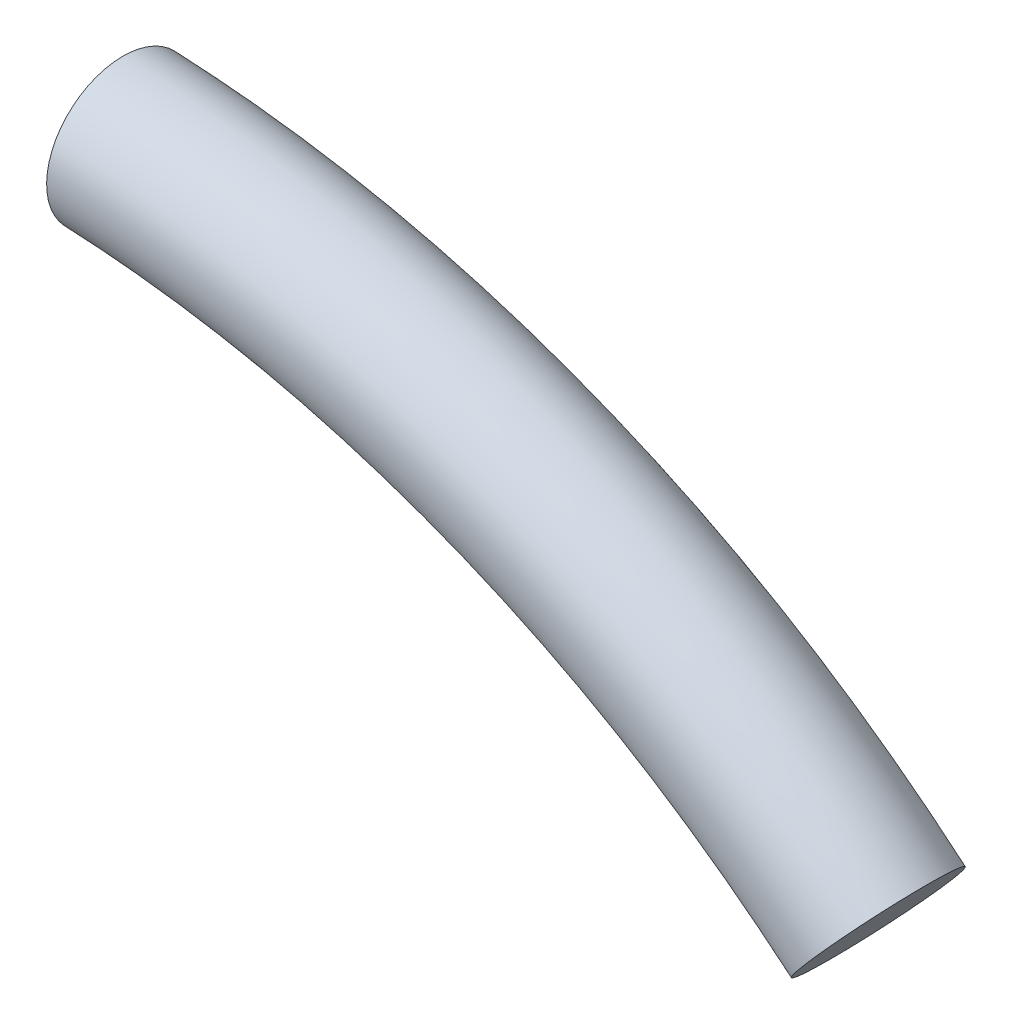
ISO-10303-21;
HEADER;
FILE_DESCRIPTION(('STEP AP214'),'2;1');
FILE_NAME('part.step','',(''),(''),'','','');
FILE_SCHEMA(('AUTOMOTIVE_DESIGN { 1 0 10303 214 1 1 1 1 }'));
ENDSEC;
DATA;
#1=APPLICATION_CONTEXT('core data for automotive mechanical design processes');
#2=APPLICATION_PROTOCOL_DEFINITION('international standard','automotive_design',2000,#1);
#3=PRODUCT_CONTEXT('',#1,'mechanical');
#4=PRODUCT('Part','Part','',(#3));
#5=PRODUCT_RELATED_PRODUCT_CATEGORY('part','',(#4));
#6=PRODUCT_DEFINITION_FORMATION('','',#4);
#7=PRODUCT_DEFINITION_CONTEXT('part definition',#1,'design');
#8=PRODUCT_DEFINITION('design','',#6,#7);
#9=PRODUCT_DEFINITION_SHAPE('','',#8);
#10=(LENGTH_UNIT() NAMED_UNIT(*) SI_UNIT(.MILLI.,.METRE.));
#11=(NAMED_UNIT(*) PLANE_ANGLE_UNIT() SI_UNIT($,.RADIAN.));
#12=(NAMED_UNIT(*) SI_UNIT($,.STERADIAN.) SOLID_ANGLE_UNIT());
#13=UNCERTAINTY_MEASURE_WITH_UNIT(LENGTH_MEASURE(1.E-05),#10,'distance_accuracy_value','');
#14=(GEOMETRIC_REPRESENTATION_CONTEXT(3) GLOBAL_UNCERTAINTY_ASSIGNED_CONTEXT((#13)) GLOBAL_UNIT_ASSIGNED_CONTEXT((#10,
#11,#12)) REPRESENTATION_CONTEXT('',''));
#15=CARTESIAN_POINT('',(0.,0.,0.));
#16=DIRECTION('',(0.,0.,1.));
#17=DIRECTION('',(1.,0.,0.));
#18=AXIS2_PLACEMENT_3D('',#15,#16,#17);
#19=CARTESIAN_POINT('',(0.,0.,-107.5));
#20=DIRECTION('',(0.759975633659856,-0.649951564536389,0.));
#21=DIRECTION('',(0.649951564536389,0.759975633659856,0.));
#22=AXIS2_PLACEMENT_3D('',#19,#20,#21);
#23=PLANE('',#22);
#24=CARTESIAN_POINT('',(4.72006253645162,5.51907667090961,-102.2302));
#25=CARTESIAN_POINT('',(4.72006133685012,5.51907526823907,-102.25265524156));
#26=CARTESIAN_POINT('',(4.71882902740505,5.51763435294248,-102.275130857259));
#27=CARTESIAN_POINT('',(4.71392650044844,5.51190192419906,-102.319482451298));
#28=CARTESIAN_POINT('',(4.71025106526411,5.50760430982962,-102.341357041711));
#29=CARTESIAN_POINT('',(4.7005717856094,5.49628651771968,-102.383809618347));
#30=CARTESIAN_POINT('',(4.69457209694046,5.48927119927638,-102.404389843003));
#31=CARTESIAN_POINT('',(4.68040349251983,5.47270412765109,-102.443737337222));
#32=CARTESIAN_POINT('',(4.67223149947683,5.46314877625264,-102.46250198299));
#33=CARTESIAN_POINT('',(4.65396766069821,5.44179322730686,-102.497627484938));
#34=CARTESIAN_POINT('',(4.64387853832205,5.42999621413041,-102.513991693303));
#35=CARTESIAN_POINT('',(4.62204353491342,5.40446497233199,-102.543904884907));
#36=CARTESIAN_POINT('',(4.6102953543539,5.39072805491809,-102.557449895039));
#37=CARTESIAN_POINT('',(4.58549604826536,5.36173071205854,-102.581301941874));
#38=CARTESIAN_POINT('',(4.57244587798105,5.34647140356182,-102.5916113298));
#39=CARTESIAN_POINT('',(4.54540503770203,5.31485307867878,-102.608713483024));
#40=CARTESIAN_POINT('',(4.5314143124317,5.29849399765978,-102.615506041437));
#41=CARTESIAN_POINT('',(4.50289066796777,5.26514185888737,-102.625380612929));
#42=CARTESIAN_POINT('',(4.48835776473142,5.24814881979246,-102.628462735124));
#43=CARTESIAN_POINT('',(4.45916191772213,5.21401068775035,-102.630829316177));
#44=CARTESIAN_POINT('',(4.4444989739492,5.19686559480315,-102.630113775036));
#45=CARTESIAN_POINT('',(4.41545885049525,5.16290954726411,-102.624905254934));
#46=CARTESIAN_POINT('',(4.40108167923109,5.14609860251392,-102.620412164882));
#47=CARTESIAN_POINT('',(4.37302254405149,5.11328960534923,-102.607776350926));
#48=CARTESIAN_POINT('',(4.35934053929569,5.09729150518088,-102.599633841699));
#49=CARTESIAN_POINT('',(4.33304954581745,5.06654996147459,-102.579923114515));
#50=CARTESIAN_POINT('',(4.32044134647498,5.05180744094317,-102.568352403919));
#51=CARTESIAN_POINT('',(4.29668430006736,5.02402879191353,-102.542134850302));
#52=CARTESIAN_POINT('',(4.28553343754824,5.01099030678446,-102.527492330157));
#53=CARTESIAN_POINT('',(4.26497181172359,4.98694800045305,-102.495513974748));
#54=CARTESIAN_POINT('',(4.25556352776416,4.97594707830155,-102.478174365578));
#55=CARTESIAN_POINT('',(4.23878612476033,4.95632958959205,-102.441335318358));
#56=CARTESIAN_POINT('',(4.23141412465217,4.94770965426266,-102.421838987082));
#57=CARTESIAN_POINT('',(4.21888913251816,4.9330644262903,-102.381186262625));
#58=CARTESIAN_POINT('',(4.21374012041394,4.92704378729174,-102.36002697154));
#59=CARTESIAN_POINT('',(4.20583574404259,4.91780135482558,-102.316713490036));
#60=CARTESIAN_POINT('',(4.20307528577545,4.91457360504355,-102.294561523395));
#61=CARTESIAN_POINT('',(4.20058098439812,4.9116570672995,-102.258269762147));
#62=CARTESIAN_POINT('',(4.20010053483989,4.91109528704173,-102.244238862857));
#63=CARTESIAN_POINT('',(4.20010248442401,4.91109756665226,-102.20774475844));
#64=CARTESIAN_POINT('',(4.20133479386908,4.91253848194885,-102.185269142741));
#65=CARTESIAN_POINT('',(4.20623732082569,4.91827091069228,-102.140917548703));
#66=CARTESIAN_POINT('',(4.20991275601002,4.92256852506171,-102.119042958289));
#67=CARTESIAN_POINT('',(4.21959203566473,4.93388631717166,-102.076590381653));
#68=CARTESIAN_POINT('',(4.22559172433367,4.94090163561496,-102.056010156997));
#69=CARTESIAN_POINT('',(4.2397603287543,4.95746870724024,-102.016662662778));
#70=CARTESIAN_POINT('',(4.2479323217973,4.96702405863869,-101.99789801701));
#71=CARTESIAN_POINT('',(4.26619616057591,4.98837960758447,-101.962772515062));
#72=CARTESIAN_POINT('',(4.27628528295207,5.00017662076093,-101.946408306697));
#73=CARTESIAN_POINT('',(4.2981202863607,5.02570786255934,-101.916495115093));
#74=CARTESIAN_POINT('',(4.30986846692022,5.03944477997324,-101.902950104961));
#75=CARTESIAN_POINT('',(4.33466777300876,5.06844212283279,-101.879098058126));
#76=CARTESIAN_POINT('',(4.34771794329307,5.08370143132952,-101.8687886702));
#77=CARTESIAN_POINT('',(4.3747587835721,5.11531975621255,-101.851686516976));
#78=CARTESIAN_POINT('',(4.38874950884242,5.13167883723155,-101.844893958563));
#79=CARTESIAN_POINT('',(4.41727315330635,5.16503097600396,-101.835019387071));
#80=CARTESIAN_POINT('',(4.43180605654271,5.18202401509887,-101.831937264876));
#81=CARTESIAN_POINT('',(4.461001903552,5.21616214714098,-101.829570683823));
#82=CARTESIAN_POINT('',(4.47566484732493,5.23330724008818,-101.830286224964));
#83=CARTESIAN_POINT('',(4.50470497077887,5.26726328762722,-101.835494745066));
#84=CARTESIAN_POINT('',(4.51908214204304,5.28407423237741,-101.839987835118));
#85=CARTESIAN_POINT('',(4.54714127722264,5.3168832295421,-101.852623649074));
#86=CARTESIAN_POINT('',(4.56082328197844,5.33288132971045,-101.860766158301));
#87=CARTESIAN_POINT('',(4.58711427545667,5.36362287341674,-101.880476885485));
#88=CARTESIAN_POINT('',(4.59972247479914,5.37836539394816,-101.892047596081));
#89=CARTESIAN_POINT('',(4.62347952120677,5.40614404297781,-101.918265149698));
#90=CARTESIAN_POINT('',(4.63463038372589,5.41918252810687,-101.932907669844));
#91=CARTESIAN_POINT('',(4.65519200955053,5.44322483443828,-101.964886025252));
#92=CARTESIAN_POINT('',(4.66460029350996,5.45422575658979,-101.982225634422));
#93=CARTESIAN_POINT('',(4.6813776965138,5.47384324529928,-102.019064681642));
#94=CARTESIAN_POINT('',(4.68874969662196,5.48246318062867,-102.038561012918));
#95=CARTESIAN_POINT('',(4.70127468875597,5.49710840860103,-102.079213737375));
#96=CARTESIAN_POINT('',(4.70642370086018,5.50312904759959,-102.10037302846));
#97=CARTESIAN_POINT('',(4.71432807723154,5.51237148006575,-102.143686509964));
#98=CARTESIAN_POINT('',(4.71708853549867,5.51559922984778,-102.165838476605));
#99=CARTESIAN_POINT('',(4.71958283687601,5.51851576759183,-102.202130237853));
#100=CARTESIAN_POINT('',(4.72006328643424,5.5190775478496,-102.216161137143));
#101=CARTESIAN_POINT('',(4.72006253645162,5.51907667090961,-102.2302));
#102=B_SPLINE_CURVE_WITH_KNOTS('',3,(#24,#25,#26,#27,#28,#29,#30,#31,#32,#33,#34,#35,#36,#37,
#38,#39,#40,#41,#42,#43,#44,#45,#46,#47,#48,#49,#50,#51,#52,#53,#54,#55,#56,#57,#58,#59,#60,#61,
#62,#63,#64,#65,#66,#67,#68,#69,#70,#71,#72,#73,#74,#75,#76,#77,#78,#79,#80,#81,#82,#83,#84,#85,
#86,#87,#88,#89,#90,#91,#92,#93,#94,#95,#96,#97,#98,#99,#100,#101),.UNSPECIFIED.,.T.,.F.,(4,2,2,
2,2,2,2,2,2,2,2,2,2,2,2,2,2,2,2,2,2,2,2,2,2,2,2,2,2,2,2,2,2,2,2,2,2,2,4),(0.,0.0673217190940812,
0.134787678055446,0.202133559490879,0.269575356418609,0.336922056232667,0.404363034793443,
0.471754892083641,0.53915071340354,0.606544552708794,0.673938392014052,0.741334213333949,
0.808726070624146,0.876167049184931,0.943513748998995,1.01095554592845,1.07830142736559,
1.1457673863287,1.21308910542448,1.25517818200736,1.32249990110144,1.3899658600628,
1.45731174149823,1.52475353842596,1.59210023824002,1.6595412168008,1.726933074091,
1.79432889541089,1.86172273471615,1.92911657402141,1.99651239534131,2.0639042526315,
2.13134523119229,2.19869193100635,2.2661337279358,2.33347960937294,2.40094556833606,
2.46826728743184,2.51035636401471),.UNSPECIFIED.);
#103=CARTESIAN_POINT('',(4.72006253645162,5.51907667090961,-102.2302));
#104=VERTEX_POINT('',#103);
#105=EDGE_CURVE('E18',#104,#104,#102,.T.);
#106=ORIENTED_EDGE('',*,*,#105,.F.);
#107=EDGE_LOOP('',(#106));
#108=FACE_BOUND('',#107,.T.);
#109=ADVANCED_FACE('F14',(#108),#23,.T.);
#110=CARTESIAN_POINT('',(0.,0.,-107.5));
#111=DIRECTION('',(0.999019110915743,-0.0442811023476075,0.));
#112=DIRECTION('',(0.0442811023476075,0.999019110915743,0.));
#113=AXIS2_PLACEMENT_3D('',#110,#111,#112);
#114=PLANE('',#113);
#115=CARTESIAN_POINT('',(0.286152268894358,6.45583714274535,-102.2302));
#116=CARTESIAN_POINT('',(0.286152350623029,6.45583898661325,-102.25265524156));
#117=CARTESIAN_POINT('',(0.286236307680199,6.45773312881301,-102.275130857259));
#118=CARTESIAN_POINT('',(0.286570316104476,6.46526864128604,-102.319482451298));
#119=CARTESIAN_POINT('',(0.286820722950846,6.47091803147206,-102.341357041711));
#120=CARTESIAN_POINT('',(0.287480170818083,6.48579573295409,-102.383809618347));
#121=CARTESIAN_POINT('',(0.287888928704824,6.4950176565048,-102.404389843003));
#122=CARTESIAN_POINT('',(0.288854233593227,6.51679575100221,-102.443737337222));
#123=CARTESIAN_POINT('',(0.289410990250284,6.52935665195189,-102.46250198299));
#124=CARTESIAN_POINT('',(0.290655302839628,6.55742939609788,-102.497627484938));
#125=CARTESIAN_POINT('',(0.291342673229844,6.57293705330822,-102.513991693303));
#126=CARTESIAN_POINT('',(0.292830288728375,6.6064989168106,-102.543904884907));
#127=CARTESIAN_POINT('',(0.293630690503121,6.62455665762983,-102.557449895039));
#128=CARTESIAN_POINT('',(0.29532026349744,6.6626748530027,-102.581301941874));
#129=CARTESIAN_POINT('',(0.296209369636335,6.68273383928121,-102.5916113298));
#130=CARTESIAN_POINT('',(0.298051658017954,6.7242974229203,-102.608713483024));
#131=CARTESIAN_POINT('',(0.299004844026597,6.7458021052432,-102.615506041437));
#132=CARTESIAN_POINT('',(0.30094815563434,6.78964485828397,-102.625380612929));
#133=CARTESIAN_POINT('',(0.301938280146274,6.81198290447448,-102.628462735124));
#134=CARTESIAN_POINT('',(0.303927388812342,6.85685887787483,-102.630829316177));
#135=CARTESIAN_POINT('',(0.304926372966475,6.87939680508467,-102.630113775036));
#136=CARTESIAN_POINT('',(0.306904872210136,6.92403342094471,-102.624905254934));
#137=CARTESIAN_POINT('',(0.307884386726224,6.94613209665766,-102.620412164882));
#138=CARTESIAN_POINT('',(0.309796051386281,6.98926086779952,-102.607776350926));
#139=CARTESIAN_POINT('',(0.310728204312699,7.01029102600282,-102.599633841699));
#140=CARTESIAN_POINT('',(0.312519405744548,7.05070204485844,-102.579923114515));
#141=CARTESIAN_POINT('',(0.313378400469642,7.07008169218085,-102.568352403919));
#142=CARTESIAN_POINT('',(0.314996964468642,7.10659786457758,-102.542134850302));
#143=CARTESIAN_POINT('',(0.315756671055123,7.12373748753969,-102.527492330157));
#144=CARTESIAN_POINT('',(0.317157531530356,7.15534208436065,-102.495513974748));
#145=CARTESIAN_POINT('',(0.31779851650163,7.16980324729837,-102.478174365578));
#146=CARTESIAN_POINT('',(0.318941558445178,7.19559124004568,-102.441335318358));
#147=CARTESIAN_POINT('',(0.319443811703892,7.20692249824333,-102.421838987082));
#148=CARTESIAN_POINT('',(0.320297137534386,7.22617425051024,-102.381186262625));
#149=CARTESIAN_POINT('',(0.320647938954703,7.23408862717324,-102.36002697154));
#150=CARTESIAN_POINT('',(0.32118646292817,7.24623818336437,-102.316713490036));
#151=CARTESIAN_POINT('',(0.321374532534773,7.25048119271188,-102.294561523395));
#152=CARTESIAN_POINT('',(0.3215444689125,7.25431510108337,-102.258269762147));
#153=CARTESIAN_POINT('',(0.321577201868649,7.2550535842515,-102.244238862857));
#154=CARTESIAN_POINT('',(0.321577069043776,7.25505058761005,-102.20774475844));
#155=CARTESIAN_POINT('',(0.321493111986606,7.25315644541029,-102.185269142741));
#156=CARTESIAN_POINT('',(0.321159103562328,7.24562093293726,-102.140917548703));
#157=CARTESIAN_POINT('',(0.320908696715957,7.23997154275124,-102.119042958289));
#158=CARTESIAN_POINT('',(0.32024924884872,7.22509384126921,-102.076590381653));
#159=CARTESIAN_POINT('',(0.319840490961981,7.21587191771851,-102.056010156997));
#160=CARTESIAN_POINT('',(0.318875186073576,7.1940938232211,-102.016662662778));
#161=CARTESIAN_POINT('',(0.318318429416515,7.18153292227142,-101.99789801701));
#162=CARTESIAN_POINT('',(0.317074116827171,7.15346017812541,-101.962772515062));
#163=CARTESIAN_POINT('',(0.316386746436959,7.13795252091508,-101.946408306697));
#164=CARTESIAN_POINT('',(0.314899130938431,7.1043906574127,-101.916495115093));
#165=CARTESIAN_POINT('',(0.314098729163683,7.08633291659347,-101.902950104961));
#166=CARTESIAN_POINT('',(0.312409156169363,7.0482147212206,-101.879098058126));
#167=CARTESIAN_POINT('',(0.311520050030469,7.02815573494209,-101.8687886702));
#168=CARTESIAN_POINT('',(0.309677761648851,6.98659215130299,-101.851686516976));
#169=CARTESIAN_POINT('',(0.308724575640208,6.96508746898009,-101.844893958563));
#170=CARTESIAN_POINT('',(0.306781264032465,6.92124471593933,-101.835019387071));
#171=CARTESIAN_POINT('',(0.30579113952053,6.89890666974882,-101.831937264876));
#172=CARTESIAN_POINT('',(0.303802030854463,6.85403069634847,-101.829570683823));
#173=CARTESIAN_POINT('',(0.302803046700332,6.83149276913863,-101.830286224964));
#174=CARTESIAN_POINT('',(0.300824547456672,6.78685615327859,-101.835494745066));
#175=CARTESIAN_POINT('',(0.299845032940582,6.76475747756565,-101.839987835118));
#176=CARTESIAN_POINT('',(0.297933368280522,6.72162870642379,-101.852623649074));
#177=CARTESIAN_POINT('',(0.297001215354104,6.70059854822048,-101.860766158301));
#178=CARTESIAN_POINT('',(0.295210013922255,6.66018752936487,-101.880476885485));
#179=CARTESIAN_POINT('',(0.294351019197162,6.64080788204245,-101.892047596081));
#180=CARTESIAN_POINT('',(0.292732455198163,6.60429170964573,-101.918265149698));
#181=CARTESIAN_POINT('',(0.291972748611681,6.58715208668361,-101.932907669844));
#182=CARTESIAN_POINT('',(0.290571888136448,6.55554748986266,-101.964886025252));
#183=CARTESIAN_POINT('',(0.289930903165175,6.54108632692494,-101.982225634422));
#184=CARTESIAN_POINT('',(0.288787861221626,6.51529833417762,-102.019064681642));
#185=CARTESIAN_POINT('',(0.288285607962911,6.50396707597997,-102.038561012918));
#186=CARTESIAN_POINT('',(0.287432282132417,6.48471532371306,-102.079213737375));
#187=CARTESIAN_POINT('',(0.287081480712101,6.47680094705006,-102.10037302846));
#188=CARTESIAN_POINT('',(0.286542956738635,6.46465139085893,-102.143686509964));
#189=CARTESIAN_POINT('',(0.286354887132031,6.46040838151142,-102.165838476605));
#190=CARTESIAN_POINT('',(0.286184950754304,6.45657447313993,-102.202130237853));
#191=CARTESIAN_POINT('',(0.286152217798155,6.45583598997181,-102.216161137143));
#192=CARTESIAN_POINT('',(0.286152268894358,6.45583714274535,-102.2302));
#193=B_SPLINE_CURVE_WITH_KNOTS('',3,(#115,#116,#117,#118,#119,#120,#121,#122,#123,#124,#125,
#126,#127,#128,#129,#130,#131,#132,#133,#134,#135,#136,#137,#138,#139,#140,#141,#142,#143,#144,
#145,#146,#147,#148,#149,#150,#151,#152,#153,#154,#155,#156,#157,#158,#159,#160,#161,#162,#163,
#164,#165,#166,#167,#168,#169,#170,#171,#172,#173,#174,#175,#176,#177,#178,#179,#180,#181,#182,
#183,#184,#185,#186,#187,#188,#189,#190,#191,#192),.UNSPECIFIED.,.T.,.F.,(4,2,2,2,2,2,2,2,2,2,2,
2,2,2,2,2,2,2,2,2,2,2,2,2,2,2,2,2,2,2,2,2,2,2,2,2,2,2,4),(0.,0.0673217190940813,
0.134787678055445,0.202133559490878,0.269575356418609,0.336922056232666,0.404363034793442,
0.47175489208364,0.539150713403541,0.606544552708796,0.673938392014054,0.74133421333395,
0.808726070624147,0.876167049184933,0.943513748998996,1.01095554592844,1.07830142736559,
1.1457673863287,1.21308910542448,1.25517818200736,1.32249990110144,1.3899658600628,
1.45731174149825,1.52475353842597,1.59210023824004,1.65954121680081,1.72693307409101,
1.79432889541091,1.86172273471616,1.92911657402141,1.99651239534131,2.06390425263151,
2.13134523119229,2.19869193100636,2.26613372793581,2.33347960937295,2.40094556833607,
2.46826728743185,2.51035636401472),.UNSPECIFIED.);
#194=CARTESIAN_POINT('',(0.286152268894358,6.45583714274535,-102.2302));
#195=VERTEX_POINT('',#194);
#196=EDGE_CURVE('E10',#195,#195,#193,.T.);
#197=ORIENTED_EDGE('',*,*,#196,.F.);
#198=EDGE_LOOP('',(#197));
#199=FACE_BOUND('',#198,.T.);
#200=ADVANCED_FACE('F34',(#199),#114,.F.);
#201=CARTESIAN_POINT('',(0.,0.,-102.2302));
#202=DIRECTION('',(0.,0.,1.));
#203=DIRECTION('',(0.759975633659856,-0.649951564536389,0.));
#204=AXIS2_PLACEMENT_3D('',#201,#202,#203);
#205=TOROIDAL_SURFACE('',#204,6.86217582046821,0.4);
#206=ORIENTED_EDGE('',*,*,#105,.T.);
#207=EDGE_LOOP('',(#206));
#208=FACE_BOUND('',#207,.T.);
#209=ORIENTED_EDGE('',*,*,#196,.T.);
#210=EDGE_LOOP('',(#209));
#211=FACE_BOUND('',#210,.T.);
#212=ADVANCED_FACE('F36',(#208,#211),#205,.T.);
#213=CLOSED_SHELL('',(#109,#200,#212));
#214=MANIFOLD_SOLID_BREP('B1',#213);
#215=ADVANCED_BREP_SHAPE_REPRESENTATION('',(#18,#214),#14);
#216=SHAPE_DEFINITION_REPRESENTATION(#9,#215);
ENDSEC;
END-ISO-10303-21;
